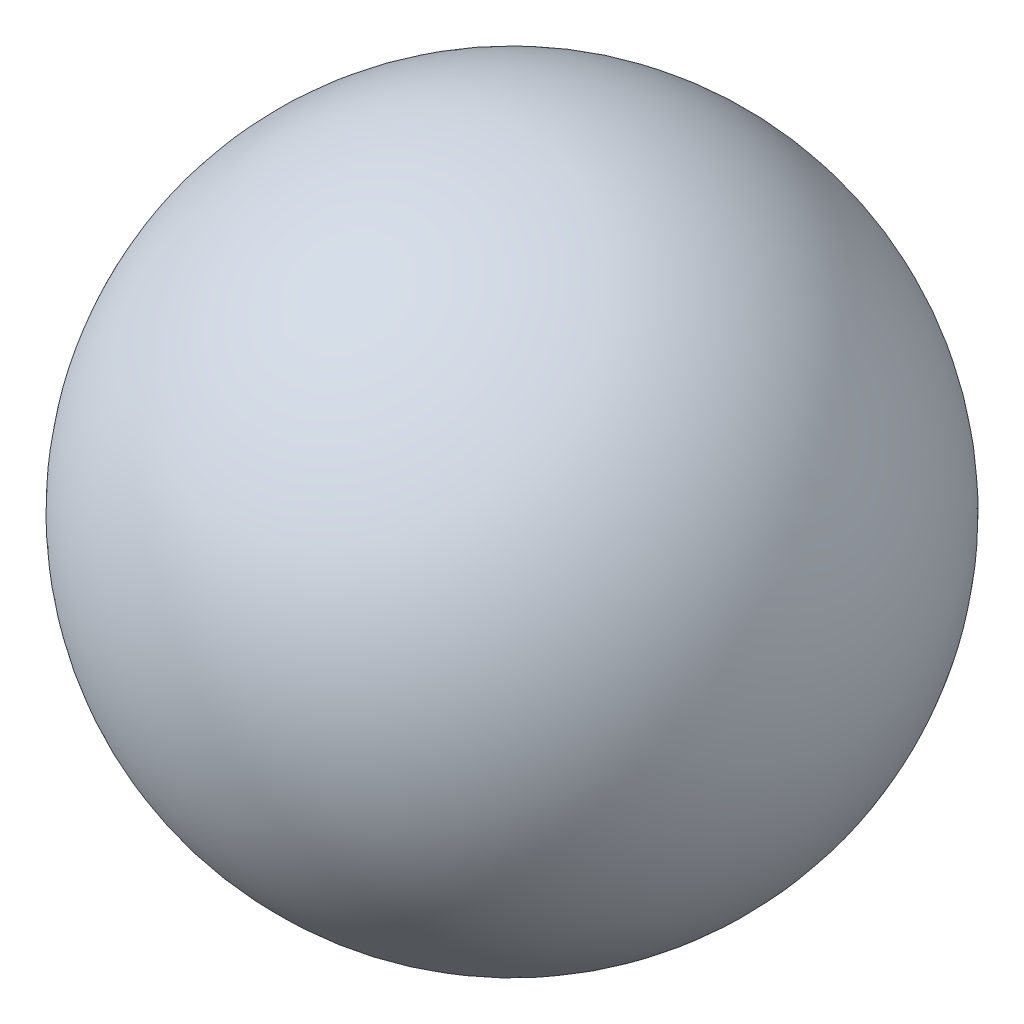
ISO-10303-21;
HEADER;
FILE_DESCRIPTION(('STEP AP214'),'2;1');
FILE_NAME('part.step','',(''),(''),'','','');
FILE_SCHEMA(('AUTOMOTIVE_DESIGN { 1 0 10303 214 1 1 1 1 }'));
ENDSEC;
DATA;
#1=APPLICATION_CONTEXT('core data for automotive mechanical design processes');
#2=APPLICATION_PROTOCOL_DEFINITION('international standard','automotive_design',2000,#1);
#3=PRODUCT_CONTEXT('',#1,'mechanical');
#4=PRODUCT('Part','Part','',(#3));
#5=PRODUCT_RELATED_PRODUCT_CATEGORY('part','',(#4));
#6=PRODUCT_DEFINITION_FORMATION('','',#4);
#7=PRODUCT_DEFINITION_CONTEXT('part definition',#1,'design');
#8=PRODUCT_DEFINITION('design','',#6,#7);
#9=PRODUCT_DEFINITION_SHAPE('','',#8);
#10=(LENGTH_UNIT() NAMED_UNIT(*) SI_UNIT(.MILLI.,.METRE.));
#11=(NAMED_UNIT(*) PLANE_ANGLE_UNIT() SI_UNIT($,.RADIAN.));
#12=(NAMED_UNIT(*) SI_UNIT($,.STERADIAN.) SOLID_ANGLE_UNIT());
#13=UNCERTAINTY_MEASURE_WITH_UNIT(LENGTH_MEASURE(1.E-05),#10,'distance_accuracy_value','');
#14=(GEOMETRIC_REPRESENTATION_CONTEXT(3) GLOBAL_UNCERTAINTY_ASSIGNED_CONTEXT((#13)) GLOBAL_UNIT_ASSIGNED_CONTEXT((#10,
#11,#12)) REPRESENTATION_CONTEXT('',''));
#15=CARTESIAN_POINT('',(0.,0.,0.));
#16=DIRECTION('',(0.,0.,1.));
#17=DIRECTION('',(1.,0.,0.));
#18=AXIS2_PLACEMENT_3D('',#15,#16,#17);
#19=CARTESIAN_POINT('',(0.,0.,0.));
#20=DIRECTION('',(-1.,0.,0.));
#21=DIRECTION('',(0.,0.,-1.));
#22=AXIS2_PLACEMENT_3D('',#19,#20,#21);
#23=SPHERICAL_SURFACE('',#22,6.4);
#24=CARTESIAN_POINT('',(-6.4,0.,0.));
#25=VERTEX_POINT('',#24);
#26=VERTEX_LOOP('',#25);
#27=FACE_BOUND('',#26,.T.);
#28=ADVANCED_FACE('F38',(#27),#23,.T.);
#29=CLOSED_SHELL('',(#28));
#30=CARTESIAN_POINT('',(-6.4,0.,0.));
#31=DIRECTION('',(-1.,0.,0.));
#32=DIRECTION('',(0.,0.,1.));
#33=AXIS2_PLACEMENT_3D('',#30,#31,#32);
#34=CYLINDRICAL_SURFACE('',#33,1.);
#35=CARTESIAN_POINT('',(5.30659966456864,0.,0.));
#36=DIRECTION('',(-1.,0.,0.));
#37=DIRECTION('',(0.,0.,1.));
#38=AXIS2_PLACEMENT_3D('',#35,#36,#37);
#39=CIRCLE('',#38,1.);
#40=CARTESIAN_POINT('',(5.30659966456864,0.,-0.999999999999994));
#41=VERTEX_POINT('',#40);
#42=EDGE_CURVE('E10',#41,#41,#39,.T.);
#43=ORIENTED_EDGE('',*,*,#42,.T.);
#44=EDGE_LOOP('',(#43));
#45=FACE_BOUND('',#44,.T.);
#46=CARTESIAN_POINT('',(-5.30659966456864,0.,0.));
#47=DIRECTION('',(-1.,0.,0.));
#48=DIRECTION('',(0.,0.,1.));
#49=AXIS2_PLACEMENT_3D('',#46,#47,#48);
#50=CIRCLE('',#49,1.);
#51=CARTESIAN_POINT('',(-5.30659966456864,0.,-1.));
#52=VERTEX_POINT('',#51);
#53=EDGE_CURVE('E45',#52,#52,#50,.T.);
#54=ORIENTED_EDGE('',*,*,#53,.F.);
#55=EDGE_LOOP('',(#54));
#56=FACE_BOUND('',#55,.T.);
#57=ADVANCED_FACE('F55',(#45,#56),#34,.T.);
#58=CARTESIAN_POINT('',(0.,0.,0.));
#59=DIRECTION('',(-1.,0.,0.));
#60=DIRECTION('',(0.,0.,-1.));
#61=AXIS2_PLACEMENT_3D('',#58,#59,#60);
#62=SPHERICAL_SURFACE('',#61,5.4);
#63=CARTESIAN_POINT('',(-5.30659966456864,0.,-1.));
#64=CARTESIAN_POINT('',(-5.27777262532855,0.,-1.15307105145404));
#65=CARTESIAN_POINT('',(-5.24228854645871,0.,-1.30488485925306));
#66=CARTESIAN_POINT('',(-5.15834841014183,0.,-1.60488332687367));
#67=CARTESIAN_POINT('',(-5.10989235269478,0.,-1.75306798669526));
#68=CARTESIAN_POINT('',(-5.00035035990577,0.,-2.04469349769359));
#69=CARTESIAN_POINT('',(-4.9392644245638,0.,-2.18813434887033));
#70=CARTESIAN_POINT('',(-4.80492530173544,0.,-2.46920035865117));
#71=CARTESIAN_POINT('',(-4.73167211424905,0.,-2.60682551725527));
#72=CARTESIAN_POINT('',(-4.57354519538559,0.,-2.8752298290976));
#73=CARTESIAN_POINT('',(-4.48867146400851,0.,-3.00600898233583));
#74=CARTESIAN_POINT('',(-4.30793899401268,0.,-3.25974272434967));
#75=CARTESIAN_POINT('',(-4.21208025539392,0.,-3.38269731312529));
#76=CARTESIAN_POINT('',(-4.01009501210173,0.,-3.61986178127606));
#77=CARTESIAN_POINT('',(-3.9039685074283,0.,-3.73407166065121));
#78=CARTESIAN_POINT('',(-3.68224194484302,0.,-3.95289204251855));
#79=CARTESIAN_POINT('',(-3.56664188693118,0.,-4.05750254501073));
#80=CARTESIAN_POINT('',(-3.32683328891445,0.,-4.25634133131989));
#81=CARTESIAN_POINT('',(-3.20262474880956,0.,-4.35056961513687));
#82=CARTESIAN_POINT('',(-2.94652868758314,0.,-4.52793881903718));
#83=CARTESIAN_POINT('',(-2.8146411664616,0.,-4.61107973912051));
#84=CARTESIAN_POINT('',(-2.54417410649701,0.,-4.76565204067918));
#85=CARTESIAN_POINT('',(-2.40559456765396,0.,-4.83708342215453));
#86=CARTESIAN_POINT('',(-2.12278051511389,0.,-4.96770209869025));
#87=CARTESIAN_POINT('',(-1.97854600141687,0.,-5.02688939375062));
#88=CARTESIAN_POINT('',(-1.6855013601513,0.,-5.13257697669352));
#89=CARTESIAN_POINT('',(-1.53669123258276,0.,-5.17907726457604));
#90=CARTESIAN_POINT('',(-1.23560896564283,0.,-5.25904285405252));
#91=CARTESIAN_POINT('',(-1.08333682627144,0.,-5.29250815564649));
#92=CARTESIAN_POINT('',(-0.776470045315403,0.,-5.34615333912805));
#93=CARTESIAN_POINT('',(-0.621875403730751,0.,-5.36633322101565));
#94=CARTESIAN_POINT('',(-0.311520508097398,0.,-5.39325655145163));
#95=CARTESIAN_POINT('',(-0.155760254048696,0.,-5.4));
#96=CARTESIAN_POINT('',(0.155760254048706,0.,-5.4));
#97=CARTESIAN_POINT('',(0.311520508097407,0.,-5.39325655145163));
#98=CARTESIAN_POINT('',(0.621875403730761,0.,-5.36633322101565));
#99=CARTESIAN_POINT('',(0.776470045315413,0.,-5.34615333912805));
#100=CARTESIAN_POINT('',(1.08333682627145,0.,-5.29250815564649));
#101=CARTESIAN_POINT('',(1.23560896564284,0.,-5.25904285405252));
#102=CARTESIAN_POINT('',(1.53669123258277,0.,-5.17907726457604));
#103=CARTESIAN_POINT('',(1.68550136015131,0.,-5.13257697669352));
#104=CARTESIAN_POINT('',(1.97854600141687,0.,-5.02688939375062));
#105=CARTESIAN_POINT('',(2.1227805151139,0.,-4.96770209869024));
#106=CARTESIAN_POINT('',(2.40559456765397,0.,-4.83708342215452));
#107=CARTESIAN_POINT('',(2.54417410649702,0.,-4.76565204067918));
#108=CARTESIAN_POINT('',(2.81464116646161,0.,-4.61107973912051));
#109=CARTESIAN_POINT('',(2.94652868758315,0.,-4.52793881903718));
#110=CARTESIAN_POINT('',(3.20262474880957,0.,-4.35056961513687));
#111=CARTESIAN_POINT('',(3.32683328891446,0.,-4.25634133131989));
#112=CARTESIAN_POINT('',(3.56664188693119,0.,-4.05750254501072));
#113=CARTESIAN_POINT('',(3.68224194484303,0.,-3.95289204251854));
#114=CARTESIAN_POINT('',(3.90396850742831,0.,-3.73407166065121));
#115=CARTESIAN_POINT('',(4.01009501210174,0.,-3.61986178127605));
#116=CARTESIAN_POINT('',(4.21208025539393,0.,-3.38269731312528));
#117=CARTESIAN_POINT('',(4.30793899401269,0.,-3.25974272434967));
#118=CARTESIAN_POINT('',(4.48867146400852,0.,-3.00600898233582));
#119=CARTESIAN_POINT('',(4.57354519538559,0.,-2.87522982909759));
#120=CARTESIAN_POINT('',(4.73167211424906,0.,-2.60682551725526));
#121=CARTESIAN_POINT('',(4.80492530173544,0.,-2.46920035865116));
#122=CARTESIAN_POINT('',(4.9392644245638,0.,-2.18813434887032));
#123=CARTESIAN_POINT('',(5.00035035990577,0.,-2.04469349769358));
#124=CARTESIAN_POINT('',(5.10989235269479,0.,-1.75306798669525));
#125=CARTESIAN_POINT('',(5.15834841014183,0.,-1.60488332687366));
#126=CARTESIAN_POINT('',(5.24228854645871,0.,-1.30488485925305));
#127=CARTESIAN_POINT('',(5.27777262532855,0.,-1.15307105145403));
#128=CARTESIAN_POINT('',(5.30659966456864,0.,-0.999999999999994));
#129=B_SPLINE_CURVE_WITH_KNOTS('',3,(#63,#64,#65,#66,#67,#68,#69,#70,#71,#72,#73,#74,#75,#76,
#77,#78,#79,#80,#81,#82,#83,#84,#85,#86,#87,#88,#89,#90,#91,#92,#93,#94,#95,#96,#97,#98,#99,
#100,#101,#102,#103,#104,#105,#106,#107,#108,#109,#110,#111,#112,#113,#114,#115,#116,#117,#118,
#119,#120,#121,#122,#123,#124,#125,#126,#127,#128),.UNSPECIFIED.,.F.,.F.,(4,2,2,2,2,2,2,2,2,2,2,
2,2,2,2,2,2,2,2,2,2,2,2,2,2,2,2,2,2,2,2,2,4),(0.,0.467135128925979,0.934270257851959,
1.40140538677794,1.86854051570392,2.3356756446299,2.80281077355587,3.26994590248185,
3.73708103140783,4.20421616033381,4.67135128925979,5.13848641818577,5.60562154711175,
6.07275667603773,6.5398918049637,7.00702693388968,7.47416206281566,7.94129719174164,
8.40843232066762,8.8755674495936,9.34270257851958,9.80983770744556,10.2769728363715,
10.7441079652975,11.2112430942235,11.6783782231495,12.1455133520755,12.6126484810014,
13.0797836099274,13.5469187388534,14.0140538677794,14.4811889967053,14.9483241256313),.UNSPECIFIED.);
#130=EDGE_CURVE('BSEAM52',#52,#41,#129,.T.);
#131=ORIENTED_EDGE('',*,*,#53,.T.);
#132=ORIENTED_EDGE('',*,*,#42,.F.);
#133=ORIENTED_EDGE('',*,*,#130,.T.);
#134=ORIENTED_EDGE('',*,*,#130,.F.);
#135=EDGE_LOOP('',(#131,#133,#132,#134));
#136=FACE_BOUND('',#135,.T.);
#137=ADVANCED_FACE('F52',(#136),#62,.F.);
#138=CLOSED_SHELL('',(#57,#137));
#139=ORIENTED_CLOSED_SHELL('',*,#138,.T.);
#140=BREP_WITH_VOIDS('B2',#29,(#139));
#141=ADVANCED_BREP_SHAPE_REPRESENTATION('',(#18,#140),#14);
#142=SHAPE_DEFINITION_REPRESENTATION(#9,#141);
ENDSEC;
END-ISO-10303-21;
